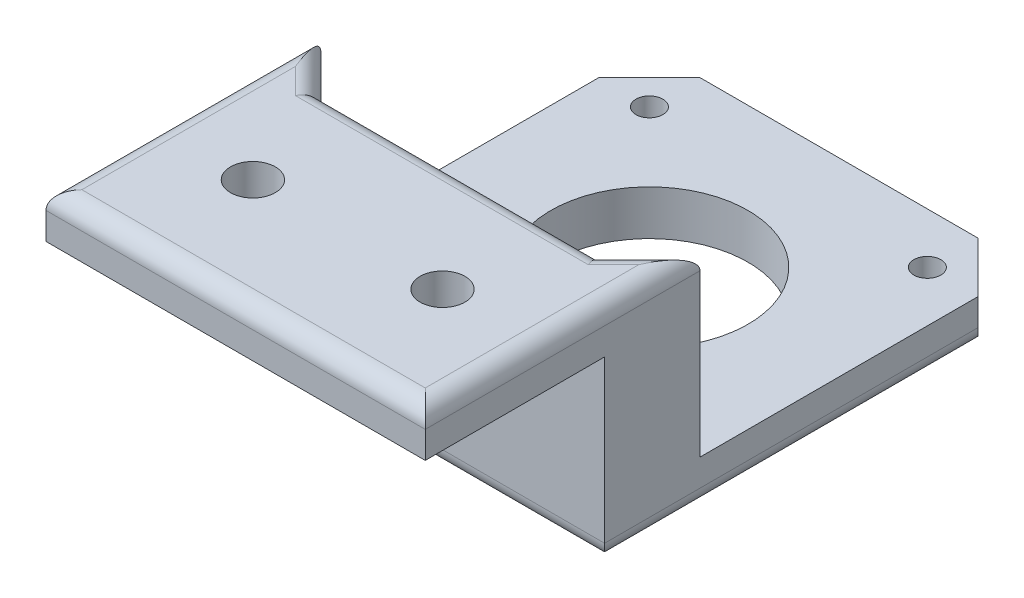
ISO-10303-21;
HEADER;
FILE_DESCRIPTION(('STEP AP214'),'2;1');
FILE_NAME('part.step','',(''),(''),'','','');
FILE_SCHEMA(('AUTOMOTIVE_DESIGN { 1 0 10303 214 1 1 1 1 }'));
ENDSEC;
DATA;
#1=APPLICATION_CONTEXT('core data for automotive mechanical design processes');
#2=APPLICATION_PROTOCOL_DEFINITION('international standard','automotive_design',2000,#1);
#3=PRODUCT_CONTEXT('',#1,'mechanical');
#4=PRODUCT('Part','Part','',(#3));
#5=PRODUCT_RELATED_PRODUCT_CATEGORY('part','',(#4));
#6=PRODUCT_DEFINITION_FORMATION('','',#4);
#7=PRODUCT_DEFINITION_CONTEXT('part definition',#1,'design');
#8=PRODUCT_DEFINITION('design','',#6,#7);
#9=PRODUCT_DEFINITION_SHAPE('','',#8);
#10=(LENGTH_UNIT() NAMED_UNIT(*) SI_UNIT(.MILLI.,.METRE.));
#11=(NAMED_UNIT(*) PLANE_ANGLE_UNIT() SI_UNIT($,.RADIAN.));
#12=(NAMED_UNIT(*) SI_UNIT($,.STERADIAN.) SOLID_ANGLE_UNIT());
#13=UNCERTAINTY_MEASURE_WITH_UNIT(LENGTH_MEASURE(1.E-05),#10,'distance_accuracy_value','');
#14=(GEOMETRIC_REPRESENTATION_CONTEXT(3) GLOBAL_UNCERTAINTY_ASSIGNED_CONTEXT((#13)) GLOBAL_UNIT_ASSIGNED_CONTEXT((#10,
#11,#12)) REPRESENTATION_CONTEXT('',''));
#15=CARTESIAN_POINT('',(0.,0.,0.));
#16=DIRECTION('',(0.,0.,1.));
#17=DIRECTION('',(1.,0.,0.));
#18=AXIS2_PLACEMENT_3D('',#15,#16,#17);
#19=CARTESIAN_POINT('',(42.3,-15.,0.));
#20=DIRECTION('',(0.,1.,0.));
#21=DIRECTION('',(0.,0.,1.));
#22=AXIS2_PLACEMENT_3D('',#19,#20,#21);
#23=PLANE('',#22);
#24=CARTESIAN_POINT('',(5.65,-15.,-30.65));
#25=DIRECTION('',(0.,1.,0.));
#26=DIRECTION('',(0.,0.,1.));
#27=AXIS2_PLACEMENT_3D('',#24,#25,#26);
#28=CIRCLE('',#27,1.5);
#29=CARTESIAN_POINT('',(5.65,-15.,-29.15));
#30=VERTEX_POINT('',#29);
#31=EDGE_CURVE('E277',#30,#30,#28,.F.);
#32=ORIENTED_EDGE('',*,*,#31,.T.);
#33=EDGE_LOOP('',(#32));
#34=FACE_BOUND('',#33,.T.);
#35=CARTESIAN_POINT('',(21.15,-15.,-46.15));
#36=DIRECTION('',(0.,1.,0.));
#37=DIRECTION('',(0.,0.,1.));
#38=AXIS2_PLACEMENT_3D('',#35,#36,#37);
#39=CIRCLE('',#38,11.);
#40=CARTESIAN_POINT('',(21.15,-15.,-35.15));
#41=VERTEX_POINT('',#40);
#42=EDGE_CURVE('E268',#41,#41,#39,.T.);
#43=ORIENTED_EDGE('',*,*,#42,.F.);
#44=EDGE_LOOP('',(#43));
#45=FACE_BOUND('',#44,.T.);
#46=CARTESIAN_POINT('',(5.65,-15.,-61.65));
#47=DIRECTION('',(0.,1.,0.));
#48=DIRECTION('',(0.,0.,1.));
#49=AXIS2_PLACEMENT_3D('',#46,#47,#48);
#50=CIRCLE('',#49,1.5);
#51=CARTESIAN_POINT('',(5.65,-15.,-60.15));
#52=VERTEX_POINT('',#51);
#53=EDGE_CURVE('E269',#52,#52,#50,.T.);
#54=ORIENTED_EDGE('',*,*,#53,.F.);
#55=EDGE_LOOP('',(#54));
#56=FACE_BOUND('',#55,.T.);
#57=CARTESIAN_POINT('',(36.65,-15.,-61.65));
#58=DIRECTION('',(0.,1.,0.));
#59=DIRECTION('',(0.,0.,1.));
#60=AXIS2_PLACEMENT_3D('',#57,#58,#59);
#61=CIRCLE('',#60,1.5);
#62=CARTESIAN_POINT('',(36.65,-15.,-60.15));
#63=VERTEX_POINT('',#62);
#64=EDGE_CURVE('E273',#63,#63,#61,.F.);
#65=ORIENTED_EDGE('',*,*,#64,.T.);
#66=EDGE_LOOP('',(#65));
#67=FACE_BOUND('',#66,.T.);
#68=CARTESIAN_POINT('',(36.65,-15.,-30.65));
#69=DIRECTION('',(0.,1.,0.));
#70=DIRECTION('',(0.,0.,1.));
#71=AXIS2_PLACEMENT_3D('',#68,#69,#70);
#72=CIRCLE('',#71,1.5);
#73=CARTESIAN_POINT('',(36.65,-15.,-29.15));
#74=VERTEX_POINT('',#73);
#75=EDGE_CURVE('E281',#74,#74,#72,.T.);
#76=ORIENTED_EDGE('',*,*,#75,.F.);
#77=EDGE_LOOP('',(#76));
#78=FACE_BOUND('',#77,.T.);
#79=DIRECTION('',(-1.,0.,0.));
#80=VECTOR('',#79,1.);
#81=CARTESIAN_POINT('',(42.3,-15.,-25.));
#82=LINE('',#81,#80);
#83=CARTESIAN_POINT('',(36.65,-15.,-25.));
#84=VERTEX_POINT('',#83);
#85=CARTESIAN_POINT('',(5.64999999999999,-15.,-25.));
#86=VERTEX_POINT('',#85);
#87=EDGE_CURVE('E202',#84,#86,#82,.T.);
#88=ORIENTED_EDGE('',*,*,#87,.F.);
#89=DIRECTION('',(0.707106781186548,0.,-0.707106781186547));
#90=VECTOR('',#89,1.);
#91=CARTESIAN_POINT('',(5.82499999999998,-15.,5.82499999999999));
#92=LINE('',#91,#90);
#93=CARTESIAN_POINT('',(42.3,-15.,-30.65));
#94=VERTEX_POINT('',#93);
#95=EDGE_CURVE('E189',#84,#94,#92,.T.);
#96=ORIENTED_EDGE('',*,*,#95,.T.);
#97=DIRECTION('',(0.,0.,-1.));
#98=VECTOR('',#97,1.);
#99=CARTESIAN_POINT('',(42.3,-15.,0.));
#100=LINE('',#99,#98);
#101=CARTESIAN_POINT('',(42.3,-15.,-61.65));
#102=VERTEX_POINT('',#101);
#103=EDGE_CURVE('E199',#94,#102,#100,.T.);
#104=ORIENTED_EDGE('',*,*,#103,.T.);
#105=DIRECTION('',(0.707106781186548,0.,0.707106781186547));
#106=VECTOR('',#105,1.);
#107=CARTESIAN_POINT('',(73.125,-15.,-30.825));
#108=LINE('',#107,#106);
#109=CARTESIAN_POINT('',(36.65,-15.,-67.3));
#110=VERTEX_POINT('',#109);
#111=EDGE_CURVE('E337',#110,#102,#108,.T.);
#112=ORIENTED_EDGE('',*,*,#111,.F.);
#113=DIRECTION('',(-1.,0.,0.));
#114=VECTOR('',#113,1.);
#115=CARTESIAN_POINT('',(42.3,-15.,-67.3));
#116=LINE('',#115,#114);
#117=CARTESIAN_POINT('',(5.64999999999999,-15.,-67.3));
#118=VERTEX_POINT('',#117);
#119=EDGE_CURVE('E237',#110,#118,#116,.T.);
#120=ORIENTED_EDGE('',*,*,#119,.T.);
#121=DIRECTION('',(-0.707106781186548,0.,0.707106781186547));
#122=VECTOR('',#121,1.);
#123=CARTESIAN_POINT('',(-9.67499999999998,-15.,-51.9750000000001));
#124=LINE('',#123,#122);
#125=CARTESIAN_POINT('',(0.,-15.,-61.65));
#126=VERTEX_POINT('',#125);
#127=EDGE_CURVE('E219',#118,#126,#124,.T.);
#128=ORIENTED_EDGE('',*,*,#127,.T.);
#129=DIRECTION('',(0.,0.,-1.));
#130=VECTOR('',#129,1.);
#131=CARTESIAN_POINT('',(0.,-15.,0.));
#132=LINE('',#131,#130);
#133=CARTESIAN_POINT('',(0.,-15.,-30.65));
#134=VERTEX_POINT('',#133);
#135=EDGE_CURVE('E215',#134,#126,#132,.T.);
#136=ORIENTED_EDGE('',*,*,#135,.F.);
#137=DIRECTION('',(-0.707106781186548,0.,-0.707106781186547));
#138=VECTOR('',#137,1.);
#139=CARTESIAN_POINT('',(15.325,-15.,-15.325));
#140=LINE('',#139,#138);
#141=EDGE_CURVE('E359',#86,#134,#140,.T.);
#142=ORIENTED_EDGE('',*,*,#141,.F.);
#143=EDGE_LOOP('',(#88,#96,#104,#112,#120,#128,#136,#142));
#144=FACE_BOUND('',#143,.T.);
#145=ADVANCED_FACE('F58',(#34,#45,#56,#67,#78,#144),#23,.T.);
#146=CARTESIAN_POINT('',(42.3,0.,-25.));
#147=DIRECTION('',(0.,0.,-1.));
#148=DIRECTION('',(0.,1.,0.));
#149=AXIS2_PLACEMENT_3D('',#146,#147,#148);
#150=PLANE('',#149);
#151=DIRECTION('',(0.,1.,0.));
#152=VECTOR('',#151,1.);
#153=CARTESIAN_POINT('',(5.64999999999999,-15.,-25.));
#154=LINE('',#153,#152);
#155=CARTESIAN_POINT('',(5.64999999999999,3.,-25.));
#156=VERTEX_POINT('',#155);
#157=EDGE_CURVE('E357',#86,#156,#154,.T.);
#158=ORIENTED_EDGE('',*,*,#157,.T.);
#159=DIRECTION('',(-1.,0.,0.));
#160=VECTOR('',#159,1.);
#161=CARTESIAN_POINT('',(42.3,3.,-25.));
#162=LINE('',#161,#160);
#163=CARTESIAN_POINT('',(36.65,3.,-25.));
#164=VERTEX_POINT('',#163);
#165=EDGE_CURVE('E75',#156,#164,#162,.F.);
#166=ORIENTED_EDGE('',*,*,#165,.T.);
#167=DIRECTION('',(0.,1.,0.));
#168=VECTOR('',#167,1.);
#169=CARTESIAN_POINT('',(36.65,-15.,-25.));
#170=LINE('',#169,#168);
#171=EDGE_CURVE('E194',#84,#164,#170,.T.);
#172=ORIENTED_EDGE('',*,*,#171,.F.);
#173=ORIENTED_EDGE('',*,*,#87,.T.);
#174=EDGE_LOOP('',(#158,#166,#172,#173));
#175=FACE_BOUND('',#174,.T.);
#176=ADVANCED_FACE('F469',(#175),#150,.T.);
#177=CARTESIAN_POINT('',(42.3,-20.,0.));
#178=DIRECTION('',(0.,1.,0.));
#179=DIRECTION('',(0.,0.,1.));
#180=AXIS2_PLACEMENT_3D('',#177,#178,#179);
#181=PLANE('',#180);
#182=DIRECTION('',(-0.707106781186548,0.,0.707106781186547));
#183=VECTOR('',#182,1.);
#184=CARTESIAN_POINT('',(-9.67499999999998,-20.,-51.9750000000001));
#185=LINE('',#184,#183);
#186=CARTESIAN_POINT('',(3.64999999999999,-20.,-65.3));
#187=VERTEX_POINT('',#186);
#188=CARTESIAN_POINT('',(2.,-20.,-63.65));
#189=VERTEX_POINT('',#188);
#190=EDGE_CURVE('E328',#187,#189,#185,.T.);
#191=ORIENTED_EDGE('',*,*,#190,.F.);
#192=DIRECTION('',(-1.,0.,0.));
#193=VECTOR('',#192,1.);
#194=CARTESIAN_POINT('',(42.3,-20.,-65.3));
#195=LINE('',#194,#193);
#196=CARTESIAN_POINT('',(38.65,-20.,-65.3));
#197=VERTEX_POINT('',#196);
#198=EDGE_CURVE('E305',#187,#197,#195,.F.);
#199=ORIENTED_EDGE('',*,*,#198,.T.);
#200=DIRECTION('',(0.707106781186548,0.,0.707106781186547));
#201=VECTOR('',#200,1.);
#202=CARTESIAN_POINT('',(73.125,-20.,-30.825));
#203=LINE('',#202,#201);
#204=CARTESIAN_POINT('',(40.3,-20.,-63.65));
#205=VERTEX_POINT('',#204);
#206=EDGE_CURVE('E314',#197,#205,#203,.T.);
#207=ORIENTED_EDGE('',*,*,#206,.T.);
#208=DIRECTION('',(0.,0.,-1.));
#209=VECTOR('',#208,1.);
#210=CARTESIAN_POINT('',(40.3,-20.,-20.));
#211=LINE('',#210,#209);
#212=CARTESIAN_POINT('',(40.3,-20.,-22.));
#213=VERTEX_POINT('',#212);
#214=EDGE_CURVE('E303',#205,#213,#211,.F.);
#215=ORIENTED_EDGE('',*,*,#214,.T.);
#216=DIRECTION('',(-1.,0.,0.));
#217=VECTOR('',#216,1.);
#218=CARTESIAN_POINT('',(0.,-20.,-22.));
#219=LINE('',#218,#217);
#220=CARTESIAN_POINT('',(2.,-20.,-22.));
#221=VERTEX_POINT('',#220);
#222=EDGE_CURVE('E299',#213,#221,#219,.T.);
#223=ORIENTED_EDGE('',*,*,#222,.T.);
#224=DIRECTION('',(0.,0.,-1.));
#225=VECTOR('',#224,1.);
#226=CARTESIAN_POINT('',(2.,-20.,0.));
#227=LINE('',#226,#225);
#228=EDGE_CURVE('E301',#221,#189,#227,.T.);
#229=ORIENTED_EDGE('',*,*,#228,.T.);
#230=EDGE_LOOP('',(#191,#199,#207,#215,#223,#229));
#231=FACE_BOUND('',#230,.T.);
#232=CARTESIAN_POINT('',(36.65,-20.,-30.65));
#233=DIRECTION('',(0.,1.,0.));
#234=DIRECTION('',(0.,0.,1.));
#235=AXIS2_PLACEMENT_3D('',#232,#233,#234);
#236=CIRCLE('',#235,1.5);
#237=CARTESIAN_POINT('',(36.65,-20.,-29.15));
#238=VERTEX_POINT('',#237);
#239=EDGE_CURVE('E282',#238,#238,#236,.T.);
#240=ORIENTED_EDGE('',*,*,#239,.T.);
#241=EDGE_LOOP('',(#240));
#242=FACE_BOUND('',#241,.T.);
#243=CARTESIAN_POINT('',(36.65,-20.,-61.65));
#244=DIRECTION('',(0.,1.,0.));
#245=DIRECTION('',(0.,0.,1.));
#246=AXIS2_PLACEMENT_3D('',#243,#244,#245);
#247=CIRCLE('',#246,1.5);
#248=CARTESIAN_POINT('',(36.65,-20.,-60.15));
#249=VERTEX_POINT('',#248);
#250=EDGE_CURVE('E274',#249,#249,#247,.F.);
#251=ORIENTED_EDGE('',*,*,#250,.F.);
#252=EDGE_LOOP('',(#251));
#253=FACE_BOUND('',#252,.T.);
#254=CARTESIAN_POINT('',(5.65,-20.,-61.65));
#255=DIRECTION('',(0.,1.,0.));
#256=DIRECTION('',(0.,0.,1.));
#257=AXIS2_PLACEMENT_3D('',#254,#255,#256);
#258=CIRCLE('',#257,1.5);
#259=CARTESIAN_POINT('',(5.65,-20.,-60.15));
#260=VERTEX_POINT('',#259);
#261=EDGE_CURVE('E270',#260,#260,#258,.T.);
#262=ORIENTED_EDGE('',*,*,#261,.T.);
#263=EDGE_LOOP('',(#262));
#264=FACE_BOUND('',#263,.T.);
#265=CARTESIAN_POINT('',(21.15,-20.,-46.15));
#266=DIRECTION('',(0.,1.,0.));
#267=DIRECTION('',(0.,0.,1.));
#268=AXIS2_PLACEMENT_3D('',#265,#266,#267);
#269=CIRCLE('',#268,11.);
#270=CARTESIAN_POINT('',(21.15,-20.,-35.15));
#271=VERTEX_POINT('',#270);
#272=EDGE_CURVE('E265',#271,#271,#269,.T.);
#273=ORIENTED_EDGE('',*,*,#272,.T.);
#274=EDGE_LOOP('',(#273));
#275=FACE_BOUND('',#274,.T.);
#276=CARTESIAN_POINT('',(5.65,-20.,-30.65));
#277=DIRECTION('',(0.,1.,0.));
#278=DIRECTION('',(0.,0.,1.));
#279=AXIS2_PLACEMENT_3D('',#276,#277,#278);
#280=CIRCLE('',#279,1.5);
#281=CARTESIAN_POINT('',(5.65,-20.,-29.15));
#282=VERTEX_POINT('',#281);
#283=EDGE_CURVE('E278',#282,#282,#280,.F.);
#284=ORIENTED_EDGE('',*,*,#283,.F.);
#285=EDGE_LOOP('',(#284));
#286=FACE_BOUND('',#285,.T.);
#287=ADVANCED_FACE('F333',(#231,#242,#253,#264,#275,#286),#181,.F.);
#288=CARTESIAN_POINT('',(42.3,0.,-67.3));
#289=DIRECTION('',(0.,0.,1.));
#290=DIRECTION('',(1.,0.,0.));
#291=AXIS2_PLACEMENT_3D('',#288,#289,#290);
#292=PLANE('',#291);
#293=DIRECTION('',(0.,1.,0.));
#294=VECTOR('',#293,1.);
#295=CARTESIAN_POINT('',(36.65,-20.000025,-67.3));
#296=LINE('',#295,#294);
#297=CARTESIAN_POINT('',(36.65,-18.,-67.3));
#298=VERTEX_POINT('',#297);
#299=EDGE_CURVE('E313',#298,#110,#296,.T.);
#300=ORIENTED_EDGE('',*,*,#299,.F.);
#301=DIRECTION('',(-1.,0.,0.));
#302=VECTOR('',#301,1.);
#303=CARTESIAN_POINT('',(42.3,-18.,-67.3));
#304=LINE('',#303,#302);
#305=CARTESIAN_POINT('',(5.64999999999999,-18.,-67.3));
#306=VERTEX_POINT('',#305);
#307=EDGE_CURVE('E264',#298,#306,#304,.T.);
#308=ORIENTED_EDGE('',*,*,#307,.T.);
#309=DIRECTION('',(0.,1.,0.));
#310=VECTOR('',#309,1.);
#311=CARTESIAN_POINT('',(5.64999999999999,-20.000025,-67.3));
#312=LINE('',#311,#310);
#313=EDGE_CURVE('E331',#306,#118,#312,.T.);
#314=ORIENTED_EDGE('',*,*,#313,.T.);
#315=ORIENTED_EDGE('',*,*,#119,.F.);
#316=EDGE_LOOP('',(#300,#308,#314,#315));
#317=FACE_BOUND('',#316,.T.);
#318=ADVANCED_FACE('F320',(#317),#292,.F.);
#319=CARTESIAN_POINT('',(0.,0.,0.));
#320=DIRECTION('',(1.,0.,0.));
#321=DIRECTION('',(0.,0.,-1.));
#322=AXIS2_PLACEMENT_3D('',#319,#320,#321);
#323=PLANE('',#322);
#324=DIRECTION('',(0.,1.,0.));
#325=VECTOR('',#324,1.);
#326=CARTESIAN_POINT('',(0.,0.,-61.65));
#327=LINE('',#326,#325);
#328=CARTESIAN_POINT('',(0.,-18.,-61.65));
#329=VERTEX_POINT('',#328);
#330=EDGE_CURVE('E244',#329,#126,#327,.T.);
#331=ORIENTED_EDGE('',*,*,#330,.F.);
#332=DIRECTION('',(0.,0.,-1.));
#333=VECTOR('',#332,1.);
#334=CARTESIAN_POINT('',(0.,-18.,0.));
#335=LINE('',#334,#333);
#336=CARTESIAN_POINT('',(0.,-18.,-20.));
#337=VERTEX_POINT('',#336);
#338=EDGE_CURVE('E409',#329,#337,#335,.F.);
#339=ORIENTED_EDGE('',*,*,#338,.T.);
#340=DIRECTION('',(0.,1.,0.));
#341=VECTOR('',#340,1.);
#342=CARTESIAN_POINT('',(0.,0.,-20.));
#343=LINE('',#342,#341);
#344=CARTESIAN_POINT('',(0.,0.,-20.));
#345=VERTEX_POINT('',#344);
#346=EDGE_CURVE('E212',#337,#345,#343,.T.);
#347=ORIENTED_EDGE('',*,*,#346,.T.);
#348=DIRECTION('',(0.,0.,-1.));
#349=VECTOR('',#348,1.);
#350=CARTESIAN_POINT('',(0.,0.,0.));
#351=LINE('',#350,#349);
#352=CARTESIAN_POINT('',(0.,0.,0.));
#353=VERTEX_POINT('',#352);
#354=EDGE_CURVE('E257',#353,#345,#351,.T.);
#355=ORIENTED_EDGE('',*,*,#354,.F.);
#356=DIRECTION('',(0.,1.,0.));
#357=VECTOR('',#356,1.);
#358=CARTESIAN_POINT('',(0.,0.,0.));
#359=LINE('',#358,#357);
#360=CARTESIAN_POINT('',(0.,3.,0.));
#361=VERTEX_POINT('',#360);
#362=EDGE_CURVE('E254',#353,#361,#359,.T.);
#363=ORIENTED_EDGE('',*,*,#362,.T.);
#364=DIRECTION('',(0.,0.,-1.));
#365=VECTOR('',#364,1.);
#366=CARTESIAN_POINT('',(0.,3.,-30.65));
#367=LINE('',#366,#365);
#368=CARTESIAN_POINT('',(0.,3.,-30.65));
#369=VERTEX_POINT('',#368);
#370=EDGE_CURVE('E231',#361,#369,#367,.T.);
#371=ORIENTED_EDGE('',*,*,#370,.T.);
#372=DIRECTION('',(0.,1.,0.));
#373=VECTOR('',#372,1.);
#374=CARTESIAN_POINT('',(0.,-15.,-30.65));
#375=LINE('',#374,#373);
#376=EDGE_CURVE('E356',#134,#369,#375,.T.);
#377=ORIENTED_EDGE('',*,*,#376,.F.);
#378=ORIENTED_EDGE('',*,*,#135,.T.);
#379=EDGE_LOOP('',(#331,#339,#347,#355,#363,#371,#377,#378));
#380=FACE_BOUND('',#379,.T.);
#381=ADVANCED_FACE('F416',(#380),#323,.F.);
#382=CARTESIAN_POINT('',(42.3,0.,0.));
#383=DIRECTION('',(1.,0.,0.));
#384=DIRECTION('',(0.,0.,-1.));
#385=AXIS2_PLACEMENT_3D('',#382,#383,#384);
#386=PLANE('',#385);
#387=DIRECTION('',(0.,1.,0.));
#388=VECTOR('',#387,1.);
#389=CARTESIAN_POINT('',(42.3,0.,-20.));
#390=LINE('',#389,#388);
#391=CARTESIAN_POINT('',(42.3,-18.,-20.));
#392=VERTEX_POINT('',#391);
#393=CARTESIAN_POINT('',(42.3,0.,-20.));
#394=VERTEX_POINT('',#393);
#395=EDGE_CURVE('E211',#392,#394,#390,.T.);
#396=ORIENTED_EDGE('',*,*,#395,.F.);
#397=DIRECTION('',(0.,0.,-1.));
#398=VECTOR('',#397,1.);
#399=CARTESIAN_POINT('',(42.3,-18.,-61.65));
#400=LINE('',#399,#398);
#401=CARTESIAN_POINT('',(42.3,-18.,-61.65));
#402=VERTEX_POINT('',#401);
#403=EDGE_CURVE('E230',#392,#402,#400,.T.);
#404=ORIENTED_EDGE('',*,*,#403,.T.);
#405=DIRECTION('',(0.,-1.,0.));
#406=VECTOR('',#405,1.);
#407=CARTESIAN_POINT('',(42.3,0.,-61.65));
#408=LINE('',#407,#406);
#409=EDGE_CURVE('E210',#102,#402,#408,.T.);
#410=ORIENTED_EDGE('',*,*,#409,.F.);
#411=ORIENTED_EDGE('',*,*,#103,.F.);
#412=DIRECTION('',(0.,1.,0.));
#413=VECTOR('',#412,1.);
#414=CARTESIAN_POINT('',(42.3,-15.,-30.65));
#415=LINE('',#414,#413);
#416=CARTESIAN_POINT('',(42.3,3.,-30.65));
#417=VERTEX_POINT('',#416);
#418=EDGE_CURVE('E186',#94,#417,#415,.T.);
#419=ORIENTED_EDGE('',*,*,#418,.T.);
#420=DIRECTION('',(0.,0.,-1.));
#421=VECTOR('',#420,1.);
#422=CARTESIAN_POINT('',(42.3,3.,0.));
#423=LINE('',#422,#421);
#424=CARTESIAN_POINT('',(42.3,3.,0.));
#425=VERTEX_POINT('',#424);
#426=EDGE_CURVE('E228',#417,#425,#423,.F.);
#427=ORIENTED_EDGE('',*,*,#426,.T.);
#428=DIRECTION('',(0.,1.,0.));
#429=VECTOR('',#428,1.);
#430=CARTESIAN_POINT('',(42.3,0.,0.));
#431=LINE('',#430,#429);
#432=CARTESIAN_POINT('',(42.3,0.,0.));
#433=VERTEX_POINT('',#432);
#434=EDGE_CURVE('E245',#433,#425,#431,.T.);
#435=ORIENTED_EDGE('',*,*,#434,.F.);
#436=DIRECTION('',(0.,0.,-1.));
#437=VECTOR('',#436,1.);
#438=CARTESIAN_POINT('',(42.3,0.,0.));
#439=LINE('',#438,#437);
#440=EDGE_CURVE('E251',#433,#394,#439,.T.);
#441=ORIENTED_EDGE('',*,*,#440,.T.);
#442=EDGE_LOOP('',(#396,#404,#410,#411,#419,#427,#435,#441));
#443=FACE_BOUND('',#442,.T.);
#444=ADVANCED_FACE('F207',(#443),#386,.T.);
#445=CARTESIAN_POINT('',(42.3,0.,-20.));
#446=DIRECTION('',(0.,0.,1.));
#447=DIRECTION('',(1.,0.,0.));
#448=AXIS2_PLACEMENT_3D('',#445,#446,#447);
#449=PLANE('',#448);
#450=ORIENTED_EDGE('',*,*,#346,.F.);
#451=DIRECTION('',(-1.,0.,0.));
#452=VECTOR('',#451,1.);
#453=CARTESIAN_POINT('',(42.3,-18.,-20.));
#454=LINE('',#453,#452);
#455=EDGE_CURVE('E408',#337,#392,#454,.F.);
#456=ORIENTED_EDGE('',*,*,#455,.T.);
#457=ORIENTED_EDGE('',*,*,#395,.T.);
#458=DIRECTION('',(-1.,0.,0.));
#459=VECTOR('',#458,1.);
#460=CARTESIAN_POINT('',(42.3,0.,-20.));
#461=LINE('',#460,#459);
#462=EDGE_CURVE('E240',#394,#345,#461,.T.);
#463=ORIENTED_EDGE('',*,*,#462,.T.);
#464=EDGE_LOOP('',(#450,#456,#457,#463));
#465=FACE_BOUND('',#464,.T.);
#466=ADVANCED_FACE('F454',(#465),#449,.T.);
#467=CARTESIAN_POINT('',(42.3,5.,0.));
#468=DIRECTION('',(0.,1.,0.));
#469=DIRECTION('',(0.,0.,1.));
#470=AXIS2_PLACEMENT_3D('',#467,#468,#469);
#471=PLANE('',#470);
#472=DIRECTION('',(-0.707106781186548,0.,-0.707106781186547));
#473=VECTOR('',#472,1.);
#474=CARTESIAN_POINT('',(35.0607864376269,5.,7.23921356237308));
#475=LINE('',#474,#473);
#476=CARTESIAN_POINT('',(4.8215728752538,5.,-23.));
#477=VERTEX_POINT('',#476);
#478=CARTESIAN_POINT('',(2.,5.,-25.8215728752538));
#479=VERTEX_POINT('',#478);
#480=EDGE_CURVE('E398',#477,#479,#475,.T.);
#481=ORIENTED_EDGE('',*,*,#480,.T.);
#482=DIRECTION('',(0.,0.,-1.));
#483=VECTOR('',#482,1.);
#484=CARTESIAN_POINT('',(2.,5.,0.));
#485=LINE('',#484,#483);
#486=CARTESIAN_POINT('',(2.,5.,-2.));
#487=VERTEX_POINT('',#486);
#488=EDGE_CURVE('E396',#479,#487,#485,.F.);
#489=ORIENTED_EDGE('',*,*,#488,.T.);
#490=DIRECTION('',(-1.,0.,0.));
#491=VECTOR('',#490,1.);
#492=CARTESIAN_POINT('',(42.3,5.,-2.));
#493=LINE('',#492,#491);
#494=CARTESIAN_POINT('',(40.3,5.,-2.));
#495=VERTEX_POINT('',#494);
#496=EDGE_CURVE('E404',#487,#495,#493,.F.);
#497=ORIENTED_EDGE('',*,*,#496,.T.);
#498=DIRECTION('',(0.,0.,-1.));
#499=VECTOR('',#498,1.);
#500=CARTESIAN_POINT('',(40.3,5.,0.));
#501=LINE('',#500,#499);
#502=CARTESIAN_POINT('',(40.3,5.,-25.8215728752538));
#503=VERTEX_POINT('',#502);
#504=EDGE_CURVE('E406',#495,#503,#501,.T.);
#505=ORIENTED_EDGE('',*,*,#504,.T.);
#506=DIRECTION('',(0.707106781186548,0.,-0.707106781186547));
#507=VECTOR('',#506,1.);
#508=CARTESIAN_POINT('',(38.0642135623731,5.,-23.5857864376269));
#509=LINE('',#508,#507);
#510=CARTESIAN_POINT('',(37.4784271247462,5.,-23.));
#511=VERTEX_POINT('',#510);
#512=EDGE_CURVE('E402',#503,#511,#509,.F.);
#513=ORIENTED_EDGE('',*,*,#512,.T.);
#514=DIRECTION('',(-1.,0.,0.));
#515=VECTOR('',#514,1.);
#516=CARTESIAN_POINT('',(42.3,5.,-23.));
#517=LINE('',#516,#515);
#518=EDGE_CURVE('E377',#511,#477,#517,.T.);
#519=ORIENTED_EDGE('',*,*,#518,.T.);
#520=EDGE_LOOP('',(#481,#489,#497,#505,#513,#519));
#521=FACE_BOUND('',#520,.T.);
#522=CARTESIAN_POINT('',(31.725,5.,-12.5));
#523=DIRECTION('',(0.,1.,0.));
#524=DIRECTION('',(0.,0.,1.));
#525=AXIS2_PLACEMENT_3D('',#522,#523,#524);
#526=CIRCLE('',#525,2.5);
#527=CARTESIAN_POINT('',(31.725,5.,-9.99999999999999));
#528=VERTEX_POINT('',#527);
#529=EDGE_CURVE('E292',#528,#528,#526,.T.);
#530=ORIENTED_EDGE('',*,*,#529,.F.);
#531=EDGE_LOOP('',(#530));
#532=FACE_BOUND('',#531,.T.);
#533=CARTESIAN_POINT('',(10.575,5.,-12.5));
#534=DIRECTION('',(0.,1.,0.));
#535=DIRECTION('',(0.,0.,1.));
#536=AXIS2_PLACEMENT_3D('',#533,#534,#535);
#537=CIRCLE('',#536,2.5);
#538=CARTESIAN_POINT('',(10.575,5.,-9.99999999999999));
#539=VERTEX_POINT('',#538);
#540=EDGE_CURVE('E288',#539,#539,#537,.T.);
#541=ORIENTED_EDGE('',*,*,#540,.F.);
#542=EDGE_LOOP('',(#541));
#543=FACE_BOUND('',#542,.T.);
#544=ADVANCED_FACE('F432',(#521,#532,#543),#471,.T.);
#545=CARTESIAN_POINT('',(42.3,0.,0.));
#546=DIRECTION('',(0.,0.,1.));
#547=DIRECTION('',(1.,0.,0.));
#548=AXIS2_PLACEMENT_3D('',#545,#546,#547);
#549=PLANE('',#548);
#550=ORIENTED_EDGE('',*,*,#434,.T.);
#551=DIRECTION('',(-1.,0.,0.));
#552=VECTOR('',#551,1.);
#553=CARTESIAN_POINT('',(42.3,3.,0.));
#554=LINE('',#553,#552);
#555=EDGE_CURVE('E12',#425,#361,#554,.T.);
#556=ORIENTED_EDGE('',*,*,#555,.T.);
#557=ORIENTED_EDGE('',*,*,#362,.F.);
#558=DIRECTION('',(-1.,0.,0.));
#559=VECTOR('',#558,1.);
#560=CARTESIAN_POINT('',(42.3,0.,0.));
#561=LINE('',#560,#559);
#562=EDGE_CURVE('E250',#433,#353,#561,.T.);
#563=ORIENTED_EDGE('',*,*,#562,.F.);
#564=EDGE_LOOP('',(#550,#556,#557,#563));
#565=FACE_BOUND('',#564,.T.);
#566=ADVANCED_FACE('F441',(#565),#549,.T.);
#567=CARTESIAN_POINT('',(42.3,0.,0.));
#568=DIRECTION('',(0.,1.,0.));
#569=DIRECTION('',(0.,0.,1.));
#570=AXIS2_PLACEMENT_3D('',#567,#568,#569);
#571=PLANE('',#570);
#572=CARTESIAN_POINT('',(31.725,0.,-12.5));
#573=DIRECTION('',(0.,1.,0.));
#574=DIRECTION('',(0.,0.,1.));
#575=AXIS2_PLACEMENT_3D('',#572,#573,#574);
#576=CIRCLE('',#575,2.5);
#577=CARTESIAN_POINT('',(31.725,0.,-9.99999999999999));
#578=VERTEX_POINT('',#577);
#579=EDGE_CURVE('E289',#578,#578,#576,.T.);
#580=ORIENTED_EDGE('',*,*,#579,.T.);
#581=EDGE_LOOP('',(#580));
#582=FACE_BOUND('',#581,.T.);
#583=CARTESIAN_POINT('',(10.575,0.,-12.5));
#584=DIRECTION('',(0.,1.,0.));
#585=DIRECTION('',(0.,0.,1.));
#586=AXIS2_PLACEMENT_3D('',#583,#584,#585);
#587=CIRCLE('',#586,2.5);
#588=CARTESIAN_POINT('',(10.575,0.,-9.99999999999999));
#589=VERTEX_POINT('',#588);
#590=EDGE_CURVE('E285',#589,#589,#587,.T.);
#591=ORIENTED_EDGE('',*,*,#590,.T.);
#592=EDGE_LOOP('',(#591));
#593=FACE_BOUND('',#592,.T.);
#594=ORIENTED_EDGE('',*,*,#354,.T.);
#595=ORIENTED_EDGE('',*,*,#462,.F.);
#596=ORIENTED_EDGE('',*,*,#440,.F.);
#597=ORIENTED_EDGE('',*,*,#562,.T.);
#598=EDGE_LOOP('',(#594,#595,#596,#597));
#599=FACE_BOUND('',#598,.T.);
#600=ADVANCED_FACE('F456',(#582,#593,#599),#571,.F.);
#601=CARTESIAN_POINT('',(-30.825,-20.000025,-30.825));
#602=DIRECTION('',(-0.707106781186547,0.,-0.707106781186548));
#603=DIRECTION('',(-0.707106781186548,0.,0.707106781186547));
#604=AXIS2_PLACEMENT_3D('',#601,#602,#603);
#605=PLANE('',#604);
#606=ORIENTED_EDGE('',*,*,#313,.F.);
#607=CARTESIAN_POINT('',(3.64999999999998,-18.,-65.3));
#608=DIRECTION('',(-0.707106781186547,0.,-0.707106781186548));
#609=DIRECTION('',(-0.707106781186548,0.,0.707106781186547));
#610=AXIS2_PLACEMENT_3D('',#607,#608,#609);
#611=ELLIPSE('',#610,2.82842712474619,2.);
#612=EDGE_CURVE('E297',#306,#187,#611,.T.);
#613=ORIENTED_EDGE('',*,*,#612,.T.);
#614=ORIENTED_EDGE('',*,*,#190,.T.);
#615=CARTESIAN_POINT('',(2.,-18.,-63.65));
#616=DIRECTION('',(-0.707106781186547,0.,-0.707106781186548));
#617=DIRECTION('',(0.707106781186548,0.,-0.707106781186547));
#618=AXIS2_PLACEMENT_3D('',#615,#616,#617);
#619=ELLIPSE('',#618,2.82842712474619,2.);
#620=EDGE_CURVE('E295',#189,#329,#619,.T.);
#621=ORIENTED_EDGE('',*,*,#620,.T.);
#622=ORIENTED_EDGE('',*,*,#330,.T.);
#623=ORIENTED_EDGE('',*,*,#127,.F.);
#624=EDGE_LOOP('',(#606,#613,#614,#621,#622,#623));
#625=FACE_BOUND('',#624,.T.);
#626=ADVANCED_FACE('F327',(#625),#605,.T.);
#627=CARTESIAN_POINT('',(51.975,-20.000025,-51.9750000000001));
#628=DIRECTION('',(-0.707106781186547,0.,0.707106781186548));
#629=DIRECTION('',(0.707106781186548,0.,0.707106781186547));
#630=AXIS2_PLACEMENT_3D('',#627,#628,#629);
#631=PLANE('',#630);
#632=ORIENTED_EDGE('',*,*,#206,.F.);
#633=CARTESIAN_POINT('',(38.65,-18.,-65.3));
#634=DIRECTION('',(-0.707106781186547,0.,0.707106781186548));
#635=DIRECTION('',(-0.707106781186548,0.,-0.707106781186547));
#636=AXIS2_PLACEMENT_3D('',#633,#634,#635);
#637=ELLIPSE('',#636,2.82842712474619,2.);
#638=EDGE_CURVE('E226',#197,#298,#637,.F.);
#639=ORIENTED_EDGE('',*,*,#638,.T.);
#640=ORIENTED_EDGE('',*,*,#299,.T.);
#641=ORIENTED_EDGE('',*,*,#111,.T.);
#642=ORIENTED_EDGE('',*,*,#409,.T.);
#643=CARTESIAN_POINT('',(40.3,-18.,-63.65));
#644=DIRECTION('',(-0.707106781186547,0.,0.707106781186548));
#645=DIRECTION('',(0.707106781186548,0.,0.707106781186547));
#646=AXIS2_PLACEMENT_3D('',#643,#644,#645);
#647=ELLIPSE('',#646,2.82842712474619,2.);
#648=EDGE_CURVE('E306',#402,#205,#647,.F.);
#649=ORIENTED_EDGE('',*,*,#648,.T.);
#650=EDGE_LOOP('',(#632,#639,#640,#641,#642,#649));
#651=FACE_BOUND('',#650,.T.);
#652=ADVANCED_FACE('F312',(#651),#631,.F.);
#653=CARTESIAN_POINT('',(21.15,-20.000025,-46.15));
#654=DIRECTION('',(0.,1.,0.));
#655=DIRECTION('',(0.,0.,1.));
#656=AXIS2_PLACEMENT_3D('',#653,#654,#655);
#657=CYLINDRICAL_SURFACE('',#656,11.);
#658=ORIENTED_EDGE('',*,*,#42,.T.);
#659=EDGE_LOOP('',(#658));
#660=FACE_BOUND('',#659,.T.);
#661=ORIENTED_EDGE('',*,*,#272,.F.);
#662=EDGE_LOOP('',(#661));
#663=FACE_BOUND('',#662,.T.);
#664=ADVANCED_FACE('F534',(#660,#663),#657,.F.);
#665=CARTESIAN_POINT('',(5.65,-20.000025,-61.65));
#666=DIRECTION('',(0.,1.,0.));
#667=DIRECTION('',(0.,0.,1.));
#668=AXIS2_PLACEMENT_3D('',#665,#666,#667);
#669=CYLINDRICAL_SURFACE('',#668,1.5);
#670=ORIENTED_EDGE('',*,*,#53,.T.);
#671=EDGE_LOOP('',(#670));
#672=FACE_BOUND('',#671,.T.);
#673=ORIENTED_EDGE('',*,*,#261,.F.);
#674=EDGE_LOOP('',(#673));
#675=FACE_BOUND('',#674,.T.);
#676=ADVANCED_FACE('F658',(#672,#675),#669,.F.);
#677=CARTESIAN_POINT('',(36.65,-20.000025,-61.65));
#678=DIRECTION('',(0.,1.,0.));
#679=DIRECTION('',(0.,0.,1.));
#680=AXIS2_PLACEMENT_3D('',#677,#678,#679);
#681=CYLINDRICAL_SURFACE('',#680,1.5);
#682=ORIENTED_EDGE('',*,*,#64,.F.);
#683=EDGE_LOOP('',(#682));
#684=FACE_BOUND('',#683,.T.);
#685=ORIENTED_EDGE('',*,*,#250,.T.);
#686=EDGE_LOOP('',(#685));
#687=FACE_BOUND('',#686,.T.);
#688=ADVANCED_FACE('F654',(#684,#687),#681,.F.);
#689=CARTESIAN_POINT('',(5.65,-20.000025,-30.65));
#690=DIRECTION('',(0.,1.,0.));
#691=DIRECTION('',(0.,0.,1.));
#692=AXIS2_PLACEMENT_3D('',#689,#690,#691);
#693=CYLINDRICAL_SURFACE('',#692,1.5);
#694=ORIENTED_EDGE('',*,*,#31,.F.);
#695=EDGE_LOOP('',(#694));
#696=FACE_BOUND('',#695,.T.);
#697=ORIENTED_EDGE('',*,*,#283,.T.);
#698=EDGE_LOOP('',(#697));
#699=FACE_BOUND('',#698,.T.);
#700=ADVANCED_FACE('F650',(#696,#699),#693,.F.);
#701=CARTESIAN_POINT('',(36.65,-20.000025,-30.65));
#702=DIRECTION('',(0.,1.,0.));
#703=DIRECTION('',(0.,0.,1.));
#704=AXIS2_PLACEMENT_3D('',#701,#702,#703);
#705=CYLINDRICAL_SURFACE('',#704,1.5);
#706=ORIENTED_EDGE('',*,*,#75,.T.);
#707=EDGE_LOOP('',(#706));
#708=FACE_BOUND('',#707,.T.);
#709=ORIENTED_EDGE('',*,*,#239,.F.);
#710=EDGE_LOOP('',(#709));
#711=FACE_BOUND('',#710,.T.);
#712=ADVANCED_FACE('F646',(#708,#711),#705,.F.);
#713=CARTESIAN_POINT('',(10.575,-20.000025,-12.5));
#714=DIRECTION('',(0.,1.,0.));
#715=DIRECTION('',(0.,0.,1.));
#716=AXIS2_PLACEMENT_3D('',#713,#714,#715);
#717=CYLINDRICAL_SURFACE('',#716,2.5);
#718=ORIENTED_EDGE('',*,*,#540,.T.);
#719=EDGE_LOOP('',(#718));
#720=FACE_BOUND('',#719,.T.);
#721=ORIENTED_EDGE('',*,*,#590,.F.);
#722=EDGE_LOOP('',(#721));
#723=FACE_BOUND('',#722,.T.);
#724=ADVANCED_FACE('F642',(#720,#723),#717,.F.);
#725=CARTESIAN_POINT('',(31.725,-20.000025,-12.5));
#726=DIRECTION('',(0.,1.,0.));
#727=DIRECTION('',(0.,0.,1.));
#728=AXIS2_PLACEMENT_3D('',#725,#726,#727);
#729=CYLINDRICAL_SURFACE('',#728,2.5);
#730=ORIENTED_EDGE('',*,*,#529,.T.);
#731=EDGE_LOOP('',(#730));
#732=FACE_BOUND('',#731,.T.);
#733=ORIENTED_EDGE('',*,*,#579,.F.);
#734=EDGE_LOOP('',(#733));
#735=FACE_BOUND('',#734,.T.);
#736=ADVANCED_FACE('F545',(#732,#735),#729,.F.);
#737=CARTESIAN_POINT('',(15.325,-15.,-15.325));
#738=DIRECTION('',(0.707106781186547,0.,-0.707106781186548));
#739=DIRECTION('',(-0.707106781186548,0.,-0.707106781186547));
#740=AXIS2_PLACEMENT_3D('',#737,#738,#739);
#741=PLANE('',#740);
#742=ORIENTED_EDGE('',*,*,#376,.T.);
#743=DIRECTION('',(-0.707106781186548,0.,-0.707106781186547));
#744=VECTOR('',#743,1.);
#745=CARTESIAN_POINT('',(15.325,3.,-15.325));
#746=LINE('',#745,#744);
#747=EDGE_CURVE('E394',#369,#156,#746,.F.);
#748=ORIENTED_EDGE('',*,*,#747,.T.);
#749=ORIENTED_EDGE('',*,*,#157,.F.);
#750=ORIENTED_EDGE('',*,*,#141,.T.);
#751=EDGE_LOOP('',(#742,#748,#749,#750));
#752=FACE_BOUND('',#751,.T.);
#753=ADVANCED_FACE('F424',(#752),#741,.T.);
#754=CARTESIAN_POINT('',(5.82499999999998,-15.,5.82499999999999));
#755=DIRECTION('',(0.707106781186547,0.,0.707106781186548));
#756=DIRECTION('',(0.707106781186548,0.,-0.707106781186547));
#757=AXIS2_PLACEMENT_3D('',#754,#755,#756);
#758=PLANE('',#757);
#759=ORIENTED_EDGE('',*,*,#171,.T.);
#760=DIRECTION('',(0.707106781186548,0.,-0.707106781186547));
#761=VECTOR('',#760,1.);
#762=CARTESIAN_POINT('',(42.3,3.,-30.65));
#763=LINE('',#762,#761);
#764=EDGE_CURVE('E67',#164,#417,#763,.T.);
#765=ORIENTED_EDGE('',*,*,#764,.T.);
#766=ORIENTED_EDGE('',*,*,#418,.F.);
#767=ORIENTED_EDGE('',*,*,#95,.F.);
#768=EDGE_LOOP('',(#759,#765,#766,#767));
#769=FACE_BOUND('',#768,.T.);
#770=ADVANCED_FACE('F188',(#769),#758,.F.);
#771=CARTESIAN_POINT('',(42.3,-18.,-65.3));
#772=DIRECTION('',(-1.,0.,0.));
#773=DIRECTION('',(0.,0.,1.));
#774=AXIS2_PLACEMENT_3D('',#771,#772,#773);
#775=CYLINDRICAL_SURFACE('',#774,2.);
#776=ORIENTED_EDGE('',*,*,#638,.F.);
#777=ORIENTED_EDGE('',*,*,#198,.F.);
#778=ORIENTED_EDGE('',*,*,#612,.F.);
#779=ORIENTED_EDGE('',*,*,#307,.F.);
#780=EDGE_LOOP('',(#776,#777,#778,#779));
#781=FACE_BOUND('',#780,.T.);
#782=ADVANCED_FACE('F323',(#781),#775,.T.);
#783=CARTESIAN_POINT('',(2.,-18.,0.));
#784=DIRECTION('',(0.,0.,-1.));
#785=DIRECTION('',(-1.,0.,0.));
#786=AXIS2_PLACEMENT_3D('',#783,#784,#785);
#787=CYLINDRICAL_SURFACE('',#786,2.);
#788=ORIENTED_EDGE('',*,*,#620,.F.);
#789=ORIENTED_EDGE('',*,*,#228,.F.);
#790=CARTESIAN_POINT('',(2.,-18.,-22.));
#791=DIRECTION('',(0.707106781186547,0.,0.707106781186547));
#792=DIRECTION('',(0.707106781186547,0.,-0.707106781186547));
#793=AXIS2_PLACEMENT_3D('',#790,#791,#792);
#794=ELLIPSE('',#793,2.82842712474619,2.);
#795=EDGE_CURVE('E203',#337,#221,#794,.T.);
#796=ORIENTED_EDGE('',*,*,#795,.F.);
#797=ORIENTED_EDGE('',*,*,#338,.F.);
#798=EDGE_LOOP('',(#788,#789,#796,#797));
#799=FACE_BOUND('',#798,.T.);
#800=ADVANCED_FACE('F445',(#799),#787,.T.);
#801=CARTESIAN_POINT('',(42.3,-18.,-22.));
#802=DIRECTION('',(1.,0.,0.));
#803=DIRECTION('',(0.,0.,-1.));
#804=AXIS2_PLACEMENT_3D('',#801,#802,#803);
#805=CYLINDRICAL_SURFACE('',#804,2.);
#806=ORIENTED_EDGE('',*,*,#795,.T.);
#807=ORIENTED_EDGE('',*,*,#222,.F.);
#808=CARTESIAN_POINT('',(40.3,-18.,-22.));
#809=DIRECTION('',(0.707106781186547,0.,-0.707106781186547));
#810=DIRECTION('',(0.707106781186547,0.,0.707106781186547));
#811=AXIS2_PLACEMENT_3D('',#808,#809,#810);
#812=ELLIPSE('',#811,2.82842712474619,2.);
#813=EDGE_CURVE('E390',#392,#213,#812,.T.);
#814=ORIENTED_EDGE('',*,*,#813,.F.);
#815=ORIENTED_EDGE('',*,*,#455,.F.);
#816=EDGE_LOOP('',(#806,#807,#814,#815));
#817=FACE_BOUND('',#816,.T.);
#818=ADVANCED_FACE('F451',(#817),#805,.T.);
#819=CARTESIAN_POINT('',(40.3,-18.,0.));
#820=DIRECTION('',(0.,0.,1.));
#821=DIRECTION('',(1.,0.,0.));
#822=AXIS2_PLACEMENT_3D('',#819,#820,#821);
#823=CYLINDRICAL_SURFACE('',#822,2.);
#824=ORIENTED_EDGE('',*,*,#813,.T.);
#825=ORIENTED_EDGE('',*,*,#214,.F.);
#826=ORIENTED_EDGE('',*,*,#648,.F.);
#827=ORIENTED_EDGE('',*,*,#403,.F.);
#828=EDGE_LOOP('',(#824,#825,#826,#827));
#829=FACE_BOUND('',#828,.T.);
#830=ADVANCED_FACE('F578',(#829),#823,.T.);
#831=CARTESIAN_POINT('',(40.3,3.,0.));
#832=DIRECTION('',(0.,0.,-1.));
#833=DIRECTION('',(-1.,0.,0.));
#834=AXIS2_PLACEMENT_3D('',#831,#832,#833);
#835=CYLINDRICAL_SURFACE('',#834,2.);
#836=CARTESIAN_POINT('',(40.3,3.,-2.));
#837=DIRECTION('',(0.707106781186547,0.,-0.707106781186547));
#838=DIRECTION('',(-0.707106781186547,0.,-0.707106781186547));
#839=AXIS2_PLACEMENT_3D('',#836,#837,#838);
#840=ELLIPSE('',#839,2.82842712474619,2.);
#841=EDGE_CURVE('E378',#425,#495,#840,.F.);
#842=ORIENTED_EDGE('',*,*,#841,.F.);
#843=ORIENTED_EDGE('',*,*,#426,.F.);
#844=CARTESIAN_POINT('',(40.3,3.,-25.8215728752538));
#845=DIRECTION('',(-0.923879532511287,0.,-0.38268343236509));
#846=DIRECTION('',(0.38268343236509,0.,-0.923879532511287));
#847=AXIS2_PLACEMENT_3D('',#844,#845,#846);
#848=ELLIPSE('',#847,5.2262518595055,2.);
#849=EDGE_CURVE('E62',#503,#417,#848,.T.);
#850=ORIENTED_EDGE('',*,*,#849,.F.);
#851=ORIENTED_EDGE('',*,*,#504,.F.);
#852=EDGE_LOOP('',(#842,#843,#850,#851));
#853=FACE_BOUND('',#852,.T.);
#854=ADVANCED_FACE('F60',(#853),#835,.T.);
#855=CARTESIAN_POINT('',(7.23921356237307,3.,7.23921356237308));
#856=DIRECTION('',(-0.707106781186548,0.,0.707106781186547));
#857=DIRECTION('',(0.707106781186547,0.,0.707106781186548));
#858=AXIS2_PLACEMENT_3D('',#855,#856,#857);
#859=CYLINDRICAL_SURFACE('',#858,2.);
#860=ORIENTED_EDGE('',*,*,#849,.T.);
#861=ORIENTED_EDGE('',*,*,#764,.F.);
#862=CARTESIAN_POINT('',(37.4784271247462,3.,-23.));
#863=DIRECTION('',(-0.923879532511287,0.,0.382683432365089));
#864=DIRECTION('',(-0.382683432365089,0.,-0.923879532511287));
#865=AXIS2_PLACEMENT_3D('',#862,#863,#864);
#866=ELLIPSE('',#865,2.16478440058479,2.);
#867=EDGE_CURVE('E370',#511,#164,#866,.T.);
#868=ORIENTED_EDGE('',*,*,#867,.F.);
#869=ORIENTED_EDGE('',*,*,#512,.F.);
#870=EDGE_LOOP('',(#860,#861,#868,#869));
#871=FACE_BOUND('',#870,.T.);
#872=ADVANCED_FACE('F368',(#871),#859,.T.);
#873=CARTESIAN_POINT('',(42.3,3.,-2.));
#874=DIRECTION('',(-1.,0.,0.));
#875=DIRECTION('',(0.,0.,1.));
#876=AXIS2_PLACEMENT_3D('',#873,#874,#875);
#877=CYLINDRICAL_SURFACE('',#876,2.);
#878=ORIENTED_EDGE('',*,*,#841,.T.);
#879=ORIENTED_EDGE('',*,*,#496,.F.);
#880=CARTESIAN_POINT('',(2.,3.,-2.));
#881=DIRECTION('',(0.707106781186547,0.,0.707106781186547));
#882=DIRECTION('',(-0.707106781186547,0.,0.707106781186547));
#883=AXIS2_PLACEMENT_3D('',#880,#881,#882);
#884=ELLIPSE('',#883,2.82842712474619,2.);
#885=EDGE_CURVE('E379',#361,#487,#884,.F.);
#886=ORIENTED_EDGE('',*,*,#885,.F.);
#887=ORIENTED_EDGE('',*,*,#555,.F.);
#888=EDGE_LOOP('',(#878,#879,#886,#887));
#889=FACE_BOUND('',#888,.T.);
#890=ADVANCED_FACE('F603',(#889),#877,.T.);
#891=CARTESIAN_POINT('',(42.3,3.,-23.));
#892=DIRECTION('',(-1.,0.,0.));
#893=DIRECTION('',(0.,0.,1.));
#894=AXIS2_PLACEMENT_3D('',#891,#892,#893);
#895=CYLINDRICAL_SURFACE('',#894,2.);
#896=ORIENTED_EDGE('',*,*,#867,.T.);
#897=ORIENTED_EDGE('',*,*,#165,.F.);
#898=CARTESIAN_POINT('',(4.8215728752538,3.,-23.));
#899=DIRECTION('',(-0.923879532511287,0.,-0.382683432365089));
#900=DIRECTION('',(0.382683432365089,0.,-0.923879532511287));
#901=AXIS2_PLACEMENT_3D('',#898,#899,#900);
#902=ELLIPSE('',#901,2.16478440058479,2.);
#903=EDGE_CURVE('E83',#477,#156,#902,.T.);
#904=ORIENTED_EDGE('',*,*,#903,.F.);
#905=ORIENTED_EDGE('',*,*,#518,.F.);
#906=EDGE_LOOP('',(#896,#897,#904,#905));
#907=FACE_BOUND('',#906,.T.);
#908=ADVANCED_FACE('F375',(#907),#895,.T.);
#909=CARTESIAN_POINT('',(2.,3.,0.));
#910=DIRECTION('',(0.,0.,1.));
#911=DIRECTION('',(1.,0.,0.));
#912=AXIS2_PLACEMENT_3D('',#909,#910,#911);
#913=CYLINDRICAL_SURFACE('',#912,2.);
#914=ORIENTED_EDGE('',*,*,#885,.T.);
#915=ORIENTED_EDGE('',*,*,#488,.F.);
#916=CARTESIAN_POINT('',(2.,3.,-25.8215728752538));
#917=DIRECTION('',(-0.923879532511287,0.,0.38268343236509));
#918=DIRECTION('',(0.38268343236509,0.,0.923879532511287));
#919=AXIS2_PLACEMENT_3D('',#916,#917,#918);
#920=ELLIPSE('',#919,5.2262518595055,2.);
#921=EDGE_CURVE('E386',#369,#479,#920,.F.);
#922=ORIENTED_EDGE('',*,*,#921,.F.);
#923=ORIENTED_EDGE('',*,*,#370,.F.);
#924=EDGE_LOOP('',(#914,#915,#922,#923));
#925=FACE_BOUND('',#924,.T.);
#926=ADVANCED_FACE('F429',(#925),#913,.T.);
#927=CARTESIAN_POINT('',(35.0607864376269,3.,7.23921356237308));
#928=DIRECTION('',(-0.707106781186548,0.,-0.707106781186547));
#929=DIRECTION('',(-0.707106781186547,0.,0.707106781186548));
#930=AXIS2_PLACEMENT_3D('',#927,#928,#929);
#931=CYLINDRICAL_SURFACE('',#930,2.);
#932=ORIENTED_EDGE('',*,*,#903,.T.);
#933=ORIENTED_EDGE('',*,*,#747,.F.);
#934=ORIENTED_EDGE('',*,*,#921,.T.);
#935=ORIENTED_EDGE('',*,*,#480,.F.);
#936=EDGE_LOOP('',(#932,#933,#934,#935));
#937=FACE_BOUND('',#936,.T.);
#938=ADVANCED_FACE('F427',(#937),#931,.T.);
#939=CLOSED_SHELL('',(#145,#176,#287,#318,#381,#444,#466,#544,#566,#600,#626,#652,#664,#676,
#688,#700,#712,#724,#736,#753,#770,#782,#800,#818,#830,#854,#872,#890,#908,#926,#938));
#940=MANIFOLD_SOLID_BREP('B2',#939);
#941=ADVANCED_BREP_SHAPE_REPRESENTATION('',(#18,#940),#14);
#942=SHAPE_DEFINITION_REPRESENTATION(#9,#941);
ENDSEC;
END-ISO-10303-21;
